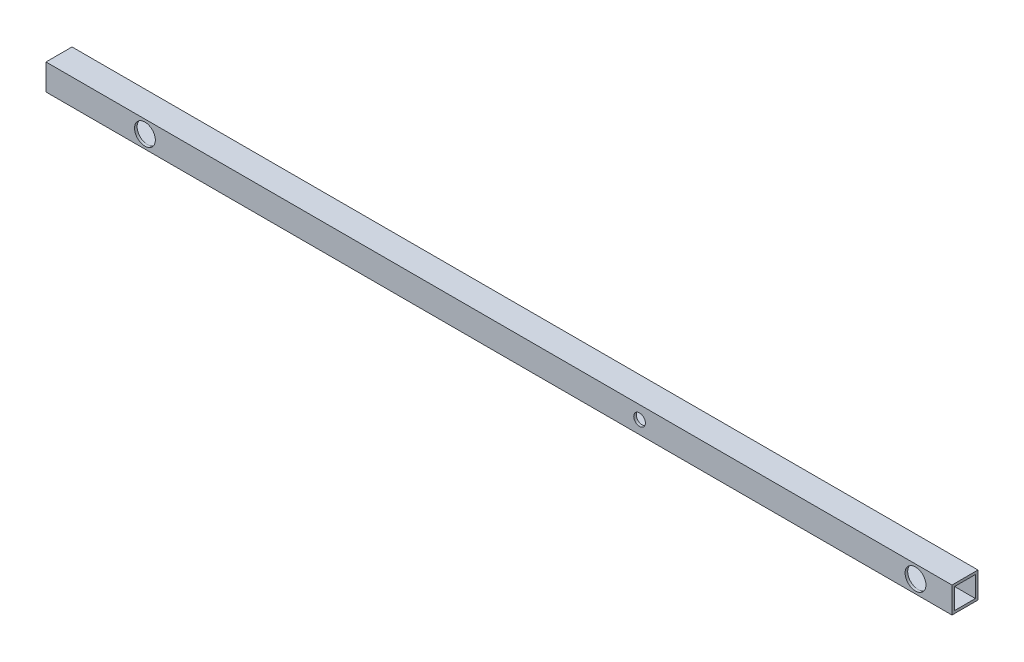
ISO-10303-21;
HEADER;
FILE_DESCRIPTION(('STEP AP214'),'2;1');
FILE_NAME('part.step','',(''),(''),'','','');
FILE_SCHEMA(('AUTOMOTIVE_DESIGN { 1 0 10303 214 1 1 1 1 }'));
ENDSEC;
DATA;
#1=APPLICATION_CONTEXT('core data for automotive mechanical design processes');
#2=APPLICATION_PROTOCOL_DEFINITION('international standard','automotive_design',2000,#1);
#3=PRODUCT_CONTEXT('',#1,'mechanical');
#4=PRODUCT('Part','Part','',(#3));
#5=PRODUCT_RELATED_PRODUCT_CATEGORY('part','',(#4));
#6=PRODUCT_DEFINITION_FORMATION('','',#4);
#7=PRODUCT_DEFINITION_CONTEXT('part definition',#1,'design');
#8=PRODUCT_DEFINITION('design','',#6,#7);
#9=PRODUCT_DEFINITION_SHAPE('','',#8);
#10=(LENGTH_UNIT() NAMED_UNIT(*) SI_UNIT(.MILLI.,.METRE.));
#11=(NAMED_UNIT(*) PLANE_ANGLE_UNIT() SI_UNIT($,.RADIAN.));
#12=(NAMED_UNIT(*) SI_UNIT($,.STERADIAN.) SOLID_ANGLE_UNIT());
#13=UNCERTAINTY_MEASURE_WITH_UNIT(LENGTH_MEASURE(1.E-05),#10,'distance_accuracy_value','');
#14=(GEOMETRIC_REPRESENTATION_CONTEXT(3) GLOBAL_UNCERTAINTY_ASSIGNED_CONTEXT((#13)) GLOBAL_UNIT_ASSIGNED_CONTEXT((#10,
#11,#12)) REPRESENTATION_CONTEXT('',''));
#15=CARTESIAN_POINT('',(0.,0.,0.));
#16=DIRECTION('',(0.,0.,1.));
#17=DIRECTION('',(1.,0.,0.));
#18=AXIS2_PLACEMENT_3D('',#15,#16,#17);
#19=CARTESIAN_POINT('',(0.,12.7,-12.7));
#20=DIRECTION('',(0.,0.,1.));
#21=DIRECTION('',(1.,0.,0.));
#22=AXIS2_PLACEMENT_3D('',#19,#20,#21);
#23=PLANE('',#22);
#24=CARTESIAN_POINT('',(723.9,0.,-12.7));
#25=DIRECTION('',(0.,0.,-1.));
#26=DIRECTION('',(-1.,0.,0.));
#27=AXIS2_PLACEMENT_3D('',#24,#25,#26);
#28=CIRCLE('',#27,7.112);
#29=CARTESIAN_POINT('',(716.788,0.,-12.7));
#30=VERTEX_POINT('',#29);
#31=EDGE_CURVE('E175',#30,#30,#28,.T.);
#32=ORIENTED_EDGE('',*,*,#31,.T.);
#33=EDGE_LOOP('',(#32));
#34=FACE_BOUND('',#33,.T.);
#35=DIRECTION('',(1.,0.,0.));
#36=VECTOR('',#35,1.);
#37=CARTESIAN_POINT('',(0.,12.7,-12.7));
#38=LINE('',#37,#36);
#39=CARTESIAN_POINT('',(120.65,12.7,-12.7));
#40=VERTEX_POINT('',#39);
#41=CARTESIAN_POINT('',(1060.45,12.7,-12.7));
#42=VERTEX_POINT('',#41);
#43=EDGE_CURVE('E122',#40,#42,#38,.T.);
#44=ORIENTED_EDGE('',*,*,#43,.F.);
#45=CARTESIAN_POINT('',(120.65,0.,-12.7));
#46=DIRECTION('',(0.,0.,-1.));
#47=DIRECTION('',(-1.,0.,0.));
#48=AXIS2_PLACEMENT_3D('',#45,#46,#47);
#49=CIRCLE('',#48,12.7);
#50=CARTESIAN_POINT('',(120.65,-12.7,-12.7));
#51=VERTEX_POINT('',#50);
#52=EDGE_CURVE('E224',#40,#51,#49,.T.);
#53=ORIENTED_EDGE('',*,*,#52,.T.);
#54=DIRECTION('',(1.,0.,0.));
#55=VECTOR('',#54,1.);
#56=CARTESIAN_POINT('',(0.,-12.7,-12.7));
#57=LINE('',#56,#55);
#58=CARTESIAN_POINT('',(1060.45,-12.7,-12.7));
#59=VERTEX_POINT('',#58);
#60=EDGE_CURVE('E179',#59,#51,#57,.F.);
#61=ORIENTED_EDGE('',*,*,#60,.F.);
#62=CARTESIAN_POINT('',(1060.45,0.,-12.7));
#63=DIRECTION('',(0.,0.,-1.));
#64=DIRECTION('',(-1.,0.,0.));
#65=AXIS2_PLACEMENT_3D('',#62,#63,#64);
#66=CIRCLE('',#65,12.7);
#67=EDGE_CURVE('E222',#59,#42,#66,.T.);
#68=ORIENTED_EDGE('',*,*,#67,.T.);
#69=EDGE_LOOP('',(#44,#53,#61,#68));
#70=FACE_BOUND('',#69,.T.);
#71=ADVANCED_FACE('F17',(#34,#70),#23,.T.);
#72=CARTESIAN_POINT('',(0.,-12.7,12.7));
#73=DIRECTION('',(0.,0.,-1.));
#74=DIRECTION('',(-1.,0.,0.));
#75=AXIS2_PLACEMENT_3D('',#72,#73,#74);
#76=PLANE('',#75);
#77=CARTESIAN_POINT('',(723.9,0.,12.7));
#78=DIRECTION('',(0.,0.,-1.));
#79=DIRECTION('',(-1.,0.,0.));
#80=AXIS2_PLACEMENT_3D('',#77,#78,#79);
#81=CIRCLE('',#80,7.112);
#82=CARTESIAN_POINT('',(716.788,0.,12.7));
#83=VERTEX_POINT('',#82);
#84=EDGE_CURVE('E229',#83,#83,#81,.F.);
#85=ORIENTED_EDGE('',*,*,#84,.T.);
#86=EDGE_LOOP('',(#85));
#87=FACE_BOUND('',#86,.T.);
#88=DIRECTION('',(1.,0.,0.));
#89=VECTOR('',#88,1.);
#90=CARTESIAN_POINT('',(0.,-12.7,12.7));
#91=LINE('',#90,#89);
#92=CARTESIAN_POINT('',(120.65,-12.7,12.7));
#93=VERTEX_POINT('',#92);
#94=CARTESIAN_POINT('',(1060.45,-12.7,12.7));
#95=VERTEX_POINT('',#94);
#96=EDGE_CURVE('E111',#93,#95,#91,.T.);
#97=ORIENTED_EDGE('',*,*,#96,.F.);
#98=CARTESIAN_POINT('',(120.65,0.,12.7));
#99=DIRECTION('',(0.,0.,-1.));
#100=DIRECTION('',(-1.,0.,0.));
#101=AXIS2_PLACEMENT_3D('',#98,#99,#100);
#102=CIRCLE('',#101,12.7);
#103=CARTESIAN_POINT('',(120.65,12.7,12.7));
#104=VERTEX_POINT('',#103);
#105=EDGE_CURVE('E20',#93,#104,#102,.F.);
#106=ORIENTED_EDGE('',*,*,#105,.T.);
#107=DIRECTION('',(1.,0.,0.));
#108=VECTOR('',#107,1.);
#109=CARTESIAN_POINT('',(0.,12.7,12.7));
#110=LINE('',#109,#108);
#111=CARTESIAN_POINT('',(1060.45,12.7,12.7));
#112=VERTEX_POINT('',#111);
#113=EDGE_CURVE('E108',#112,#104,#110,.F.);
#114=ORIENTED_EDGE('',*,*,#113,.F.);
#115=CARTESIAN_POINT('',(1060.45,0.,12.7));
#116=DIRECTION('',(0.,0.,-1.));
#117=DIRECTION('',(-1.,0.,0.));
#118=AXIS2_PLACEMENT_3D('',#115,#116,#117);
#119=CIRCLE('',#118,12.7);
#120=EDGE_CURVE('E115',#112,#95,#119,.F.);
#121=ORIENTED_EDGE('',*,*,#120,.T.);
#122=EDGE_LOOP('',(#97,#106,#114,#121));
#123=FACE_BOUND('',#122,.T.);
#124=ADVANCED_FACE('F106',(#87,#123),#76,.T.);
#125=CARTESIAN_POINT('',(120.65,0.,-15.875));
#126=DIRECTION('',(0.,0.,-1.));
#127=DIRECTION('',(-1.,0.,0.));
#128=AXIS2_PLACEMENT_3D('',#125,#126,#127);
#129=CYLINDRICAL_SURFACE('',#128,12.7);
#130=ORIENTED_EDGE('',*,*,#105,.F.);
#131=CARTESIAN_POINT('',(120.65,0.,12.7));
#132=DIRECTION('',(0.,0.,-1.));
#133=DIRECTION('',(-1.,0.,0.));
#134=AXIS2_PLACEMENT_3D('',#131,#132,#133);
#135=CIRCLE('',#134,12.7);
#136=EDGE_CURVE('E116',#104,#93,#135,.F.);
#137=ORIENTED_EDGE('',*,*,#136,.F.);
#138=EDGE_LOOP('',(#130,#137));
#139=FACE_BOUND('',#138,.T.);
#140=CARTESIAN_POINT('',(120.65,0.,15.875));
#141=DIRECTION('',(0.,0.,-1.));
#142=DIRECTION('',(-1.,0.,0.));
#143=AXIS2_PLACEMENT_3D('',#140,#141,#142);
#144=CIRCLE('',#143,12.7);
#145=CARTESIAN_POINT('',(107.95,0.,15.875));
#146=VERTEX_POINT('',#145);
#147=EDGE_CURVE('E209',#146,#146,#144,.T.);
#148=ORIENTED_EDGE('',*,*,#147,.F.);
#149=EDGE_LOOP('',(#148));
#150=FACE_BOUND('',#149,.T.);
#151=ADVANCED_FACE('F118',(#139,#150),#129,.F.);
#152=CARTESIAN_POINT('',(1060.45,0.,-15.875));
#153=DIRECTION('',(0.,0.,-1.));
#154=DIRECTION('',(-1.,0.,0.));
#155=AXIS2_PLACEMENT_3D('',#152,#153,#154);
#156=CYLINDRICAL_SURFACE('',#155,12.7);
#157=CARTESIAN_POINT('',(1060.45,0.,12.7));
#158=DIRECTION('',(0.,0.,-1.));
#159=DIRECTION('',(-1.,0.,0.));
#160=AXIS2_PLACEMENT_3D('',#157,#158,#159);
#161=CIRCLE('',#160,12.7);
#162=EDGE_CURVE('E226',#95,#112,#161,.F.);
#163=ORIENTED_EDGE('',*,*,#162,.F.);
#164=ORIENTED_EDGE('',*,*,#120,.F.);
#165=EDGE_LOOP('',(#163,#164));
#166=FACE_BOUND('',#165,.T.);
#167=CARTESIAN_POINT('',(1060.45,0.,15.875));
#168=DIRECTION('',(0.,0.,-1.));
#169=DIRECTION('',(-1.,0.,0.));
#170=AXIS2_PLACEMENT_3D('',#167,#168,#169);
#171=CIRCLE('',#170,12.7);
#172=CARTESIAN_POINT('',(1047.75,0.,15.875));
#173=VERTEX_POINT('',#172);
#174=EDGE_CURVE('E206',#173,#173,#171,.T.);
#175=ORIENTED_EDGE('',*,*,#174,.F.);
#176=EDGE_LOOP('',(#175));
#177=FACE_BOUND('',#176,.T.);
#178=ADVANCED_FACE('F234',(#166,#177),#156,.F.);
#179=CARTESIAN_POINT('',(723.9,0.,-15.875));
#180=DIRECTION('',(0.,0.,-1.));
#181=DIRECTION('',(-1.,0.,0.));
#182=AXIS2_PLACEMENT_3D('',#179,#180,#181);
#183=CYLINDRICAL_SURFACE('',#182,7.112);
#184=ORIENTED_EDGE('',*,*,#84,.F.);
#185=EDGE_LOOP('',(#184));
#186=FACE_BOUND('',#185,.T.);
#187=CARTESIAN_POINT('',(723.9,0.,15.875));
#188=DIRECTION('',(0.,0.,-1.));
#189=DIRECTION('',(-1.,0.,0.));
#190=AXIS2_PLACEMENT_3D('',#187,#188,#189);
#191=CIRCLE('',#190,7.112);
#192=CARTESIAN_POINT('',(716.788,0.,15.875));
#193=VERTEX_POINT('',#192);
#194=EDGE_CURVE('E202',#193,#193,#191,.T.);
#195=ORIENTED_EDGE('',*,*,#194,.F.);
#196=EDGE_LOOP('',(#195));
#197=FACE_BOUND('',#196,.T.);
#198=ADVANCED_FACE('F443',(#186,#197),#183,.F.);
#199=CARTESIAN_POINT('',(0.,-12.7,12.7));
#200=DIRECTION('',(0.,0.,-1.));
#201=DIRECTION('',(-1.,0.,0.));
#202=AXIS2_PLACEMENT_3D('',#199,#200,#201);
#203=PLANE('',#202);
#204=DIRECTION('',(1.,0.,0.));
#205=VECTOR('',#204,1.);
#206=CARTESIAN_POINT('',(0.,-12.7,12.7));
#207=LINE('',#206,#205);
#208=CARTESIAN_POINT('',(1104.9,-12.7,12.7));
#209=VERTEX_POINT('',#208);
#210=EDGE_CURVE('E174',#95,#209,#207,.T.);
#211=ORIENTED_EDGE('',*,*,#210,.F.);
#212=ORIENTED_EDGE('',*,*,#162,.T.);
#213=DIRECTION('',(1.,0.,0.));
#214=VECTOR('',#213,1.);
#215=CARTESIAN_POINT('',(0.,12.7,12.7));
#216=LINE('',#215,#214);
#217=CARTESIAN_POINT('',(1104.9,12.7,12.7));
#218=VERTEX_POINT('',#217);
#219=EDGE_CURVE('E136',#218,#112,#216,.F.);
#220=ORIENTED_EDGE('',*,*,#219,.F.);
#221=DIRECTION('',(0.,1.,0.));
#222=VECTOR('',#221,1.);
#223=CARTESIAN_POINT('',(1104.9,0.,12.7));
#224=LINE('',#223,#222);
#225=EDGE_CURVE('E157',#209,#218,#224,.T.);
#226=ORIENTED_EDGE('',*,*,#225,.F.);
#227=EDGE_LOOP('',(#211,#212,#220,#226));
#228=FACE_BOUND('',#227,.T.);
#229=ADVANCED_FACE('F237',(#228),#203,.T.);
#230=CARTESIAN_POINT('',(0.,12.7,-12.7));
#231=DIRECTION('',(0.,0.,1.));
#232=DIRECTION('',(1.,0.,0.));
#233=AXIS2_PLACEMENT_3D('',#230,#231,#232);
#234=PLANE('',#233);
#235=DIRECTION('',(1.,0.,0.));
#236=VECTOR('',#235,1.);
#237=CARTESIAN_POINT('',(0.,12.7,-12.7));
#238=LINE('',#237,#236);
#239=CARTESIAN_POINT('',(1104.9,12.7,-12.7));
#240=VERTEX_POINT('',#239);
#241=EDGE_CURVE('E138',#42,#240,#238,.T.);
#242=ORIENTED_EDGE('',*,*,#241,.F.);
#243=CARTESIAN_POINT('',(1060.45,0.,-12.7));
#244=DIRECTION('',(0.,0.,-1.));
#245=DIRECTION('',(-1.,0.,0.));
#246=AXIS2_PLACEMENT_3D('',#243,#244,#245);
#247=CIRCLE('',#246,12.7);
#248=EDGE_CURVE('E219',#42,#59,#247,.T.);
#249=ORIENTED_EDGE('',*,*,#248,.T.);
#250=DIRECTION('',(1.,0.,0.));
#251=VECTOR('',#250,1.);
#252=CARTESIAN_POINT('',(0.,-12.7,-12.7));
#253=LINE('',#252,#251);
#254=CARTESIAN_POINT('',(1104.9,-12.7,-12.7));
#255=VERTEX_POINT('',#254);
#256=EDGE_CURVE('E176',#255,#59,#253,.F.);
#257=ORIENTED_EDGE('',*,*,#256,.F.);
#258=DIRECTION('',(0.,1.,0.));
#259=VECTOR('',#258,1.);
#260=CARTESIAN_POINT('',(1104.9,0.,-12.7));
#261=LINE('',#260,#259);
#262=EDGE_CURVE('E156',#240,#255,#261,.F.);
#263=ORIENTED_EDGE('',*,*,#262,.F.);
#264=EDGE_LOOP('',(#242,#249,#257,#263));
#265=FACE_BOUND('',#264,.T.);
#266=ADVANCED_FACE('F304',(#265),#234,.T.);
#267=CARTESIAN_POINT('',(120.65,0.,-15.875));
#268=DIRECTION('',(0.,0.,-1.));
#269=DIRECTION('',(-1.,0.,0.));
#270=AXIS2_PLACEMENT_3D('',#267,#268,#269);
#271=CYLINDRICAL_SURFACE('',#270,12.7);
#272=CARTESIAN_POINT('',(120.65,0.,-12.7));
#273=DIRECTION('',(0.,0.,-1.));
#274=DIRECTION('',(-1.,0.,0.));
#275=AXIS2_PLACEMENT_3D('',#272,#273,#274);
#276=CIRCLE('',#275,12.7);
#277=EDGE_CURVE('E213',#51,#40,#276,.T.);
#278=ORIENTED_EDGE('',*,*,#277,.F.);
#279=ORIENTED_EDGE('',*,*,#52,.F.);
#280=EDGE_LOOP('',(#278,#279));
#281=FACE_BOUND('',#280,.T.);
#282=CARTESIAN_POINT('',(120.65,0.,-15.875));
#283=DIRECTION('',(0.,0.,-1.));
#284=DIRECTION('',(-1.,0.,0.));
#285=AXIS2_PLACEMENT_3D('',#282,#283,#284);
#286=CIRCLE('',#285,12.7);
#287=CARTESIAN_POINT('',(107.95,0.,-15.875));
#288=VERTEX_POINT('',#287);
#289=EDGE_CURVE('E198',#288,#288,#286,.F.);
#290=ORIENTED_EDGE('',*,*,#289,.F.);
#291=EDGE_LOOP('',(#290));
#292=FACE_BOUND('',#291,.T.);
#293=ADVANCED_FACE('F300',(#281,#292),#271,.F.);
#294=CARTESIAN_POINT('',(1060.45,0.,-15.875));
#295=DIRECTION('',(0.,0.,-1.));
#296=DIRECTION('',(-1.,0.,0.));
#297=AXIS2_PLACEMENT_3D('',#294,#295,#296);
#298=CYLINDRICAL_SURFACE('',#297,12.7);
#299=ORIENTED_EDGE('',*,*,#67,.F.);
#300=ORIENTED_EDGE('',*,*,#248,.F.);
#301=EDGE_LOOP('',(#299,#300));
#302=FACE_BOUND('',#301,.T.);
#303=CARTESIAN_POINT('',(1060.45,0.,-15.875));
#304=DIRECTION('',(0.,0.,-1.));
#305=DIRECTION('',(-1.,0.,0.));
#306=AXIS2_PLACEMENT_3D('',#303,#304,#305);
#307=CIRCLE('',#306,12.7);
#308=CARTESIAN_POINT('',(1047.75,0.,-15.875));
#309=VERTEX_POINT('',#308);
#310=EDGE_CURVE('E195',#309,#309,#307,.F.);
#311=ORIENTED_EDGE('',*,*,#310,.F.);
#312=EDGE_LOOP('',(#311));
#313=FACE_BOUND('',#312,.T.);
#314=ADVANCED_FACE('F303',(#302,#313),#298,.F.);
#315=CARTESIAN_POINT('',(723.9,0.,-15.875));
#316=DIRECTION('',(0.,0.,-1.));
#317=DIRECTION('',(-1.,0.,0.));
#318=AXIS2_PLACEMENT_3D('',#315,#316,#317);
#319=CYLINDRICAL_SURFACE('',#318,7.112);
#320=ORIENTED_EDGE('',*,*,#31,.F.);
#321=EDGE_LOOP('',(#320));
#322=FACE_BOUND('',#321,.T.);
#323=CARTESIAN_POINT('',(723.9,0.,-15.875));
#324=DIRECTION('',(0.,0.,-1.));
#325=DIRECTION('',(-1.,0.,0.));
#326=AXIS2_PLACEMENT_3D('',#323,#324,#325);
#327=CIRCLE('',#326,7.112);
#328=CARTESIAN_POINT('',(716.788,0.,-15.875));
#329=VERTEX_POINT('',#328);
#330=EDGE_CURVE('E191',#329,#329,#327,.F.);
#331=ORIENTED_EDGE('',*,*,#330,.F.);
#332=EDGE_LOOP('',(#331));
#333=FACE_BOUND('',#332,.T.);
#334=ADVANCED_FACE('F401',(#322,#333),#319,.F.);
#335=CARTESIAN_POINT('',(0.,-15.875,15.875));
#336=DIRECTION('',(0.,-1.,0.));
#337=DIRECTION('',(0.,0.,-1.));
#338=AXIS2_PLACEMENT_3D('',#335,#336,#337);
#339=PLANE('',#338);
#340=DIRECTION('',(1.,0.,0.));
#341=VECTOR('',#340,1.);
#342=CARTESIAN_POINT('',(0.,-15.875,15.875));
#343=LINE('',#342,#341);
#344=CARTESIAN_POINT('',(0.,-15.875,15.875));
#345=VERTEX_POINT('',#344);
#346=CARTESIAN_POINT('',(1104.9,-15.875,15.875));
#347=VERTEX_POINT('',#346);
#348=EDGE_CURVE('E212',#345,#347,#343,.T.);
#349=ORIENTED_EDGE('',*,*,#348,.F.);
#350=DIRECTION('',(0.,0.,-1.));
#351=VECTOR('',#350,1.);
#352=CARTESIAN_POINT('',(0.,-15.875,0.));
#353=LINE('',#352,#351);
#354=CARTESIAN_POINT('',(0.,-15.875,-15.875));
#355=VERTEX_POINT('',#354);
#356=EDGE_CURVE('E278',#345,#355,#353,.T.);
#357=ORIENTED_EDGE('',*,*,#356,.T.);
#358=DIRECTION('',(-1.,0.,0.));
#359=VECTOR('',#358,1.);
#360=CARTESIAN_POINT('',(0.,-15.875,-15.875));
#361=LINE('',#360,#359);
#362=CARTESIAN_POINT('',(1104.9,-15.875,-15.875));
#363=VERTEX_POINT('',#362);
#364=EDGE_CURVE('E201',#363,#355,#361,.T.);
#365=ORIENTED_EDGE('',*,*,#364,.F.);
#366=DIRECTION('',(0.,0.,-1.));
#367=VECTOR('',#366,1.);
#368=CARTESIAN_POINT('',(1104.9,-15.875,0.));
#369=LINE('',#368,#367);
#370=EDGE_CURVE('E205',#347,#363,#369,.T.);
#371=ORIENTED_EDGE('',*,*,#370,.F.);
#372=EDGE_LOOP('',(#349,#357,#365,#371));
#373=FACE_BOUND('',#372,.T.);
#374=ADVANCED_FACE('F314',(#373),#339,.T.);
#375=CARTESIAN_POINT('',(0.,-12.7,-12.7));
#376=DIRECTION('',(0.,1.,0.));
#377=DIRECTION('',(0.,0.,1.));
#378=AXIS2_PLACEMENT_3D('',#375,#376,#377);
#379=PLANE('',#378);
#380=ORIENTED_EDGE('',*,*,#60,.T.);
#381=DIRECTION('',(1.,0.,0.));
#382=VECTOR('',#381,1.);
#383=CARTESIAN_POINT('',(0.,-12.7,-12.7));
#384=LINE('',#383,#382);
#385=CARTESIAN_POINT('',(0.,-12.7,-12.7));
#386=VERTEX_POINT('',#385);
#387=EDGE_CURVE('E215',#386,#51,#384,.T.);
#388=ORIENTED_EDGE('',*,*,#387,.F.);
#389=DIRECTION('',(0.,0.,-1.));
#390=VECTOR('',#389,1.);
#391=CARTESIAN_POINT('',(0.,-12.7,0.));
#392=LINE('',#391,#390);
#393=CARTESIAN_POINT('',(0.,-12.7,12.7));
#394=VERTEX_POINT('',#393);
#395=EDGE_CURVE('E148',#386,#394,#392,.F.);
#396=ORIENTED_EDGE('',*,*,#395,.T.);
#397=DIRECTION('',(-1.,0.,0.));
#398=VECTOR('',#397,1.);
#399=CARTESIAN_POINT('',(0.,-12.7,12.7));
#400=LINE('',#399,#398);
#401=EDGE_CURVE('E123',#93,#394,#400,.T.);
#402=ORIENTED_EDGE('',*,*,#401,.F.);
#403=ORIENTED_EDGE('',*,*,#96,.T.);
#404=ORIENTED_EDGE('',*,*,#210,.T.);
#405=DIRECTION('',(0.,0.,-1.));
#406=VECTOR('',#405,1.);
#407=CARTESIAN_POINT('',(1104.9,-12.7,0.));
#408=LINE('',#407,#406);
#409=EDGE_CURVE('E170',#255,#209,#408,.F.);
#410=ORIENTED_EDGE('',*,*,#409,.F.);
#411=ORIENTED_EDGE('',*,*,#256,.T.);
#412=EDGE_LOOP('',(#380,#388,#396,#402,#403,#404,#410,#411));
#413=FACE_BOUND('',#412,.T.);
#414=ADVANCED_FACE('F241',(#413),#379,.T.);
#415=CARTESIAN_POINT('',(0.,-12.7,12.7));
#416=DIRECTION('',(0.,0.,-1.));
#417=DIRECTION('',(-1.,0.,0.));
#418=AXIS2_PLACEMENT_3D('',#415,#416,#417);
#419=PLANE('',#418);
#420=DIRECTION('',(1.,0.,0.));
#421=VECTOR('',#420,1.);
#422=CARTESIAN_POINT('',(0.,12.7,12.7));
#423=LINE('',#422,#421);
#424=CARTESIAN_POINT('',(0.,12.7,12.7));
#425=VERTEX_POINT('',#424);
#426=EDGE_CURVE('E126',#104,#425,#423,.F.);
#427=ORIENTED_EDGE('',*,*,#426,.F.);
#428=ORIENTED_EDGE('',*,*,#136,.T.);
#429=ORIENTED_EDGE('',*,*,#401,.T.);
#430=DIRECTION('',(0.,1.,0.));
#431=VECTOR('',#430,1.);
#432=CARTESIAN_POINT('',(0.,0.,12.7));
#433=LINE('',#432,#431);
#434=EDGE_CURVE('E129',#394,#425,#433,.T.);
#435=ORIENTED_EDGE('',*,*,#434,.T.);
#436=EDGE_LOOP('',(#427,#428,#429,#435));
#437=FACE_BOUND('',#436,.T.);
#438=ADVANCED_FACE('F127',(#437),#419,.T.);
#439=CARTESIAN_POINT('',(0.,12.7,12.7));
#440=DIRECTION('',(0.,-1.,0.));
#441=DIRECTION('',(0.,0.,-1.));
#442=AXIS2_PLACEMENT_3D('',#439,#440,#441);
#443=PLANE('',#442);
#444=ORIENTED_EDGE('',*,*,#113,.T.);
#445=ORIENTED_EDGE('',*,*,#426,.T.);
#446=DIRECTION('',(0.,0.,-1.));
#447=VECTOR('',#446,1.);
#448=CARTESIAN_POINT('',(0.,12.7,0.));
#449=LINE('',#448,#447);
#450=CARTESIAN_POINT('',(0.,12.7,-12.7));
#451=VERTEX_POINT('',#450);
#452=EDGE_CURVE('E147',#425,#451,#449,.T.);
#453=ORIENTED_EDGE('',*,*,#452,.T.);
#454=DIRECTION('',(1.,0.,0.));
#455=VECTOR('',#454,1.);
#456=CARTESIAN_POINT('',(0.,12.7,-12.7));
#457=LINE('',#456,#455);
#458=EDGE_CURVE('E132',#40,#451,#457,.F.);
#459=ORIENTED_EDGE('',*,*,#458,.F.);
#460=ORIENTED_EDGE('',*,*,#43,.T.);
#461=ORIENTED_EDGE('',*,*,#241,.T.);
#462=DIRECTION('',(0.,0.,-1.));
#463=VECTOR('',#462,1.);
#464=CARTESIAN_POINT('',(1104.9,12.7,0.));
#465=LINE('',#464,#463);
#466=EDGE_CURVE('E153',#218,#240,#465,.T.);
#467=ORIENTED_EDGE('',*,*,#466,.F.);
#468=ORIENTED_EDGE('',*,*,#219,.T.);
#469=EDGE_LOOP('',(#444,#445,#453,#459,#460,#461,#467,#468));
#470=FACE_BOUND('',#469,.T.);
#471=ADVANCED_FACE('F134',(#470),#443,.T.);
#472=CARTESIAN_POINT('',(0.,12.7,-12.7));
#473=DIRECTION('',(0.,0.,1.));
#474=DIRECTION('',(1.,0.,0.));
#475=AXIS2_PLACEMENT_3D('',#472,#473,#474);
#476=PLANE('',#475);
#477=ORIENTED_EDGE('',*,*,#387,.T.);
#478=ORIENTED_EDGE('',*,*,#277,.T.);
#479=ORIENTED_EDGE('',*,*,#458,.T.);
#480=DIRECTION('',(0.,1.,0.));
#481=VECTOR('',#480,1.);
#482=CARTESIAN_POINT('',(0.,0.,-12.7));
#483=LINE('',#482,#481);
#484=EDGE_CURVE('E251',#451,#386,#483,.F.);
#485=ORIENTED_EDGE('',*,*,#484,.T.);
#486=EDGE_LOOP('',(#477,#478,#479,#485));
#487=FACE_BOUND('',#486,.T.);
#488=ADVANCED_FACE('F268',(#487),#476,.T.);
#489=CARTESIAN_POINT('',(0.,15.875,15.875));
#490=DIRECTION('',(0.,0.,1.));
#491=DIRECTION('',(1.,0.,0.));
#492=AXIS2_PLACEMENT_3D('',#489,#490,#491);
#493=PLANE('',#492);
#494=ORIENTED_EDGE('',*,*,#194,.T.);
#495=EDGE_LOOP('',(#494));
#496=FACE_BOUND('',#495,.T.);
#497=ORIENTED_EDGE('',*,*,#174,.T.);
#498=EDGE_LOOP('',(#497));
#499=FACE_BOUND('',#498,.T.);
#500=ORIENTED_EDGE('',*,*,#147,.T.);
#501=EDGE_LOOP('',(#500));
#502=FACE_BOUND('',#501,.T.);
#503=DIRECTION('',(1.,0.,0.));
#504=VECTOR('',#503,1.);
#505=CARTESIAN_POINT('',(0.,15.875,15.875));
#506=LINE('',#505,#504);
#507=CARTESIAN_POINT('',(0.,15.875,15.875));
#508=VERTEX_POINT('',#507);
#509=CARTESIAN_POINT('',(1104.9,15.875,15.875));
#510=VERTEX_POINT('',#509);
#511=EDGE_CURVE('E254',#508,#510,#506,.T.);
#512=ORIENTED_EDGE('',*,*,#511,.F.);
#513=DIRECTION('',(0.,1.,0.));
#514=VECTOR('',#513,1.);
#515=CARTESIAN_POINT('',(0.,0.,15.875));
#516=LINE('',#515,#514);
#517=EDGE_CURVE('E194',#508,#345,#516,.F.);
#518=ORIENTED_EDGE('',*,*,#517,.T.);
#519=ORIENTED_EDGE('',*,*,#348,.T.);
#520=DIRECTION('',(0.,1.,0.));
#521=VECTOR('',#520,1.);
#522=CARTESIAN_POINT('',(1104.9,0.,15.875));
#523=LINE('',#522,#521);
#524=EDGE_CURVE('E162',#510,#347,#523,.F.);
#525=ORIENTED_EDGE('',*,*,#524,.F.);
#526=EDGE_LOOP('',(#512,#518,#519,#525));
#527=FACE_BOUND('',#526,.T.);
#528=ADVANCED_FACE('F316',(#496,#499,#502,#527),#493,.T.);
#529=CARTESIAN_POINT('',(1104.9,0.,0.));
#530=DIRECTION('',(1.,0.,0.));
#531=DIRECTION('',(0.,0.,-1.));
#532=AXIS2_PLACEMENT_3D('',#529,#530,#531);
#533=PLANE('',#532);
#534=ORIENTED_EDGE('',*,*,#262,.T.);
#535=ORIENTED_EDGE('',*,*,#409,.T.);
#536=ORIENTED_EDGE('',*,*,#225,.T.);
#537=ORIENTED_EDGE('',*,*,#466,.T.);
#538=EDGE_LOOP('',(#534,#535,#536,#537));
#539=FACE_BOUND('',#538,.T.);
#540=DIRECTION('',(0.,0.,1.));
#541=VECTOR('',#540,1.);
#542=CARTESIAN_POINT('',(1104.9,15.875,-15.875));
#543=LINE('',#542,#541);
#544=CARTESIAN_POINT('',(1104.9,15.875,-15.875));
#545=VERTEX_POINT('',#544);
#546=EDGE_CURVE('E321',#510,#545,#543,.F.);
#547=ORIENTED_EDGE('',*,*,#546,.F.);
#548=ORIENTED_EDGE('',*,*,#524,.T.);
#549=ORIENTED_EDGE('',*,*,#370,.T.);
#550=DIRECTION('',(0.,1.,0.));
#551=VECTOR('',#550,1.);
#552=CARTESIAN_POINT('',(1104.9,-15.875,-15.875));
#553=LINE('',#552,#551);
#554=EDGE_CURVE('E184',#545,#363,#553,.F.);
#555=ORIENTED_EDGE('',*,*,#554,.F.);
#556=EDGE_LOOP('',(#547,#548,#549,#555));
#557=FACE_BOUND('',#556,.T.);
#558=ADVANCED_FACE('F309',(#539,#557),#533,.T.);
#559=CARTESIAN_POINT('',(0.,-15.875,-15.875));
#560=DIRECTION('',(0.,0.,-1.));
#561=DIRECTION('',(-1.,0.,0.));
#562=AXIS2_PLACEMENT_3D('',#559,#560,#561);
#563=PLANE('',#562);
#564=ORIENTED_EDGE('',*,*,#330,.T.);
#565=EDGE_LOOP('',(#564));
#566=FACE_BOUND('',#565,.T.);
#567=ORIENTED_EDGE('',*,*,#310,.T.);
#568=EDGE_LOOP('',(#567));
#569=FACE_BOUND('',#568,.T.);
#570=ORIENTED_EDGE('',*,*,#289,.T.);
#571=EDGE_LOOP('',(#570));
#572=FACE_BOUND('',#571,.T.);
#573=ORIENTED_EDGE('',*,*,#364,.T.);
#574=DIRECTION('',(0.,1.,0.));
#575=VECTOR('',#574,1.);
#576=CARTESIAN_POINT('',(0.,0.,-15.875));
#577=LINE('',#576,#575);
#578=CARTESIAN_POINT('',(0.,15.875,-15.875));
#579=VERTEX_POINT('',#578);
#580=EDGE_CURVE('E35',#355,#579,#577,.T.);
#581=ORIENTED_EDGE('',*,*,#580,.T.);
#582=DIRECTION('',(1.,0.,0.));
#583=VECTOR('',#582,1.);
#584=CARTESIAN_POINT('',(0.,15.875,-15.875));
#585=LINE('',#584,#583);
#586=EDGE_CURVE('E26',#545,#579,#585,.F.);
#587=ORIENTED_EDGE('',*,*,#586,.F.);
#588=ORIENTED_EDGE('',*,*,#554,.T.);
#589=EDGE_LOOP('',(#573,#581,#587,#588));
#590=FACE_BOUND('',#589,.T.);
#591=ADVANCED_FACE('F274',(#566,#569,#572,#590),#563,.T.);
#592=CARTESIAN_POINT('',(0.,0.,0.));
#593=DIRECTION('',(1.,0.,0.));
#594=DIRECTION('',(0.,0.,-1.));
#595=AXIS2_PLACEMENT_3D('',#592,#593,#594);
#596=PLANE('',#595);
#597=ORIENTED_EDGE('',*,*,#452,.F.);
#598=ORIENTED_EDGE('',*,*,#434,.F.);
#599=ORIENTED_EDGE('',*,*,#395,.F.);
#600=ORIENTED_EDGE('',*,*,#484,.F.);
#601=EDGE_LOOP('',(#597,#598,#599,#600));
#602=FACE_BOUND('',#601,.T.);
#603=ORIENTED_EDGE('',*,*,#580,.F.);
#604=ORIENTED_EDGE('',*,*,#356,.F.);
#605=ORIENTED_EDGE('',*,*,#517,.F.);
#606=DIRECTION('',(0.,0.,1.));
#607=VECTOR('',#606,1.);
#608=CARTESIAN_POINT('',(0.,15.875,-15.875));
#609=LINE('',#608,#607);
#610=EDGE_CURVE('E11',#579,#508,#609,.T.);
#611=ORIENTED_EDGE('',*,*,#610,.F.);
#612=EDGE_LOOP('',(#603,#604,#605,#611));
#613=FACE_BOUND('',#612,.T.);
#614=ADVANCED_FACE('F270',(#602,#613),#596,.F.);
#615=CARTESIAN_POINT('',(0.,15.875,-15.875));
#616=DIRECTION('',(0.,1.,0.));
#617=DIRECTION('',(0.,0.,1.));
#618=AXIS2_PLACEMENT_3D('',#615,#616,#617);
#619=PLANE('',#618);
#620=ORIENTED_EDGE('',*,*,#586,.T.);
#621=ORIENTED_EDGE('',*,*,#610,.T.);
#622=ORIENTED_EDGE('',*,*,#511,.T.);
#623=ORIENTED_EDGE('',*,*,#546,.T.);
#624=EDGE_LOOP('',(#620,#621,#622,#623));
#625=FACE_BOUND('',#624,.T.);
#626=ADVANCED_FACE('F273',(#625),#619,.T.);
#627=CLOSED_SHELL('',(#71,#124,#151,#178,#198,#229,#266,#293,#314,#334,#374,#414,#438,#471,#488,
#528,#558,#591,#614,#626));
#628=MANIFOLD_SOLID_BREP('B1',#627);
#629=ADVANCED_BREP_SHAPE_REPRESENTATION('',(#18,#628),#14);
#630=SHAPE_DEFINITION_REPRESENTATION(#9,#629);
ENDSEC;
END-ISO-10303-21;
